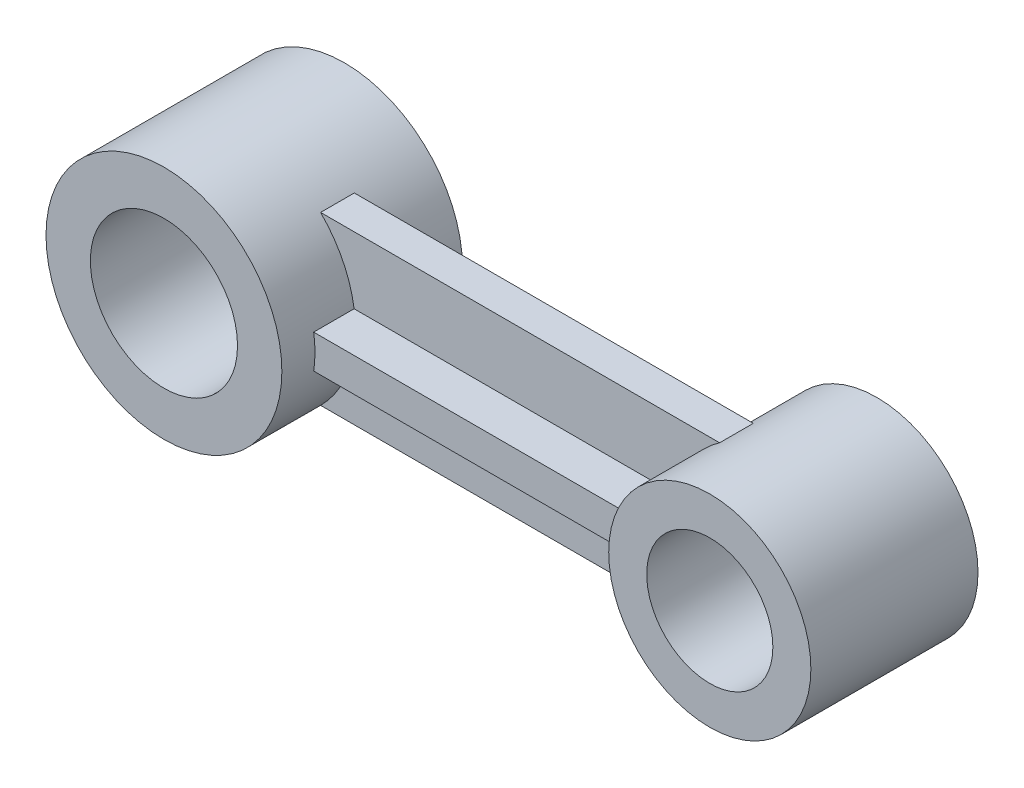
ISO-10303-21;
HEADER;
FILE_DESCRIPTION(('STEP AP214'),'2;1');
FILE_NAME('part.step','',(''),(''),'','','');
FILE_SCHEMA(('AUTOMOTIVE_DESIGN { 1 0 10303 214 1 1 1 1 }'));
ENDSEC;
DATA;
#1=APPLICATION_CONTEXT('core data for automotive mechanical design processes');
#2=APPLICATION_PROTOCOL_DEFINITION('international standard','automotive_design',2000,#1);
#3=PRODUCT_CONTEXT('',#1,'mechanical');
#4=PRODUCT('Part','Part','',(#3));
#5=PRODUCT_RELATED_PRODUCT_CATEGORY('part','',(#4));
#6=PRODUCT_DEFINITION_FORMATION('','',#4);
#7=PRODUCT_DEFINITION_CONTEXT('part definition',#1,'design');
#8=PRODUCT_DEFINITION('design','',#6,#7);
#9=PRODUCT_DEFINITION_SHAPE('','',#8);
#10=(LENGTH_UNIT() NAMED_UNIT(*) SI_UNIT(.MILLI.,.METRE.));
#11=(NAMED_UNIT(*) PLANE_ANGLE_UNIT() SI_UNIT($,.RADIAN.));
#12=(NAMED_UNIT(*) SI_UNIT($,.STERADIAN.) SOLID_ANGLE_UNIT());
#13=UNCERTAINTY_MEASURE_WITH_UNIT(LENGTH_MEASURE(1.E-05),#10,'distance_accuracy_value','');
#14=(GEOMETRIC_REPRESENTATION_CONTEXT(3) GLOBAL_UNCERTAINTY_ASSIGNED_CONTEXT((#13)) GLOBAL_UNIT_ASSIGNED_CONTEXT((#10,
#11,#12)) REPRESENTATION_CONTEXT('',''));
#15=CARTESIAN_POINT('',(0.,0.,0.));
#16=DIRECTION('',(0.,0.,1.));
#17=DIRECTION('',(1.,0.,0.));
#18=AXIS2_PLACEMENT_3D('',#15,#16,#17);
#19=CARTESIAN_POINT('',(-50.8,0.,17.018));
#20=DIRECTION('',(0.,0.,-1.));
#21=DIRECTION('',(-1.,0.,0.));
#22=AXIS2_PLACEMENT_3D('',#19,#20,#21);
#23=CYLINDRICAL_SURFACE('',#22,22.225);
#24=CARTESIAN_POINT('',(-50.8,0.,17.018));
#25=DIRECTION('',(0.,0.,1.));
#26=DIRECTION('',(1.,0.,0.));
#27=AXIS2_PLACEMENT_3D('',#24,#25,#26);
#28=CIRCLE('',#27,22.225);
#29=CARTESIAN_POINT('',(-28.575,0.,17.018));
#30=VERTEX_POINT('',#29);
#31=EDGE_CURVE('E156',#30,#30,#28,.T.);
#32=ORIENTED_EDGE('',*,*,#31,.F.);
#33=EDGE_LOOP('',(#32));
#34=FACE_BOUND('',#33,.T.);
#35=CARTESIAN_POINT('',(-50.8,0.,-17.018));
#36=DIRECTION('',(0.,0.,1.));
#37=DIRECTION('',(1.,0.,0.));
#38=AXIS2_PLACEMENT_3D('',#35,#36,#37);
#39=CIRCLE('',#38,22.225);
#40=CARTESIAN_POINT('',(-28.575,0.,-17.018));
#41=VERTEX_POINT('',#40);
#42=EDGE_CURVE('E269',#41,#41,#39,.T.);
#43=ORIENTED_EDGE('',*,*,#42,.T.);
#44=EDGE_LOOP('',(#43));
#45=FACE_BOUND('',#44,.T.);
#46=DIRECTION('',(0.,0.,-1.));
#47=VECTOR('',#46,1.);
#48=CARTESIAN_POINT('',(-28.8029547438753,3.175,17.018));
#49=LINE('',#48,#47);
#50=CARTESIAN_POINT('',(-28.8029547438753,3.175,3.175));
#51=VERTEX_POINT('',#50);
#52=CARTESIAN_POINT('',(-28.8029547438753,3.175,10.795));
#53=VERTEX_POINT('',#52);
#54=EDGE_CURVE('E194',#51,#53,#49,.F.);
#55=ORIENTED_EDGE('',*,*,#54,.F.);
#56=CARTESIAN_POINT('',(-50.8,0.,3.175));
#57=DIRECTION('',(0.,0.,1.));
#58=DIRECTION('',(1.,0.,0.));
#59=AXIS2_PLACEMENT_3D('',#56,#57,#58);
#60=CIRCLE('',#59,22.225);
#61=CARTESIAN_POINT('',(-35.1171711416594,15.748,3.175));
#62=VERTEX_POINT('',#61);
#63=EDGE_CURVE('E223',#51,#62,#60,.T.);
#64=ORIENTED_EDGE('',*,*,#63,.T.);
#65=DIRECTION('',(0.,0.,-1.));
#66=VECTOR('',#65,1.);
#67=CARTESIAN_POINT('',(-35.1171711416594,15.748,3.175));
#68=LINE('',#67,#66);
#69=CARTESIAN_POINT('',(-35.1171711416594,15.748,-3.175));
#70=VERTEX_POINT('',#69);
#71=EDGE_CURVE('E256',#62,#70,#68,.T.);
#72=ORIENTED_EDGE('',*,*,#71,.T.);
#73=CARTESIAN_POINT('',(-50.8,0.,-3.175));
#74=DIRECTION('',(0.,0.,1.));
#75=DIRECTION('',(1.,0.,0.));
#76=AXIS2_PLACEMENT_3D('',#73,#74,#75);
#77=CIRCLE('',#76,22.225);
#78=CARTESIAN_POINT('',(-28.8029547438753,3.175,-3.175));
#79=VERTEX_POINT('',#78);
#80=EDGE_CURVE('E241',#79,#70,#77,.T.);
#81=ORIENTED_EDGE('',*,*,#80,.F.);
#82=CARTESIAN_POINT('',(-28.8029547438753,3.175,-10.795));
#83=VERTEX_POINT('',#82);
#84=EDGE_CURVE('E63',#83,#79,#49,.F.);
#85=ORIENTED_EDGE('',*,*,#84,.F.);
#86=CARTESIAN_POINT('',(-50.8,0.,-10.795));
#87=DIRECTION('',(0.,0.,1.));
#88=DIRECTION('',(1.,0.,0.));
#89=AXIS2_PLACEMENT_3D('',#86,#87,#88);
#90=CIRCLE('',#89,22.225);
#91=CARTESIAN_POINT('',(-28.8029547438753,-3.175,-10.795));
#92=VERTEX_POINT('',#91);
#93=EDGE_CURVE('E67',#92,#83,#90,.T.);
#94=ORIENTED_EDGE('',*,*,#93,.F.);
#95=DIRECTION('',(0.,0.,-1.));
#96=VECTOR('',#95,1.);
#97=CARTESIAN_POINT('',(-28.8029547438753,-3.175,17.018));
#98=LINE('',#97,#96);
#99=CARTESIAN_POINT('',(-28.8029547438753,-3.175,-3.175));
#100=VERTEX_POINT('',#99);
#101=EDGE_CURVE('E159',#100,#92,#98,.T.);
#102=ORIENTED_EDGE('',*,*,#101,.F.);
#103=CARTESIAN_POINT('',(-35.1171711416594,-15.748,-3.175));
#104=VERTEX_POINT('',#103);
#105=EDGE_CURVE('E242',#104,#100,#77,.T.);
#106=ORIENTED_EDGE('',*,*,#105,.F.);
#107=DIRECTION('',(0.,0.,-1.));
#108=VECTOR('',#107,1.);
#109=CARTESIAN_POINT('',(-35.1171711416594,-15.748,3.175));
#110=LINE('',#109,#108);
#111=CARTESIAN_POINT('',(-35.1171711416594,-15.748,3.175));
#112=VERTEX_POINT('',#111);
#113=EDGE_CURVE('E252',#112,#104,#110,.T.);
#114=ORIENTED_EDGE('',*,*,#113,.F.);
#115=CARTESIAN_POINT('',(-28.8029547438753,-3.175,3.175));
#116=VERTEX_POINT('',#115);
#117=EDGE_CURVE('E224',#112,#116,#60,.T.);
#118=ORIENTED_EDGE('',*,*,#117,.T.);
#119=CARTESIAN_POINT('',(-28.8029547438753,-3.175,10.795));
#120=VERTEX_POINT('',#119);
#121=EDGE_CURVE('E181',#120,#116,#98,.T.);
#122=ORIENTED_EDGE('',*,*,#121,.F.);
#123=CARTESIAN_POINT('',(-50.8,0.,10.795));
#124=DIRECTION('',(0.,0.,1.));
#125=DIRECTION('',(1.,0.,0.));
#126=AXIS2_PLACEMENT_3D('',#123,#124,#125);
#127=CIRCLE('',#126,22.225);
#128=EDGE_CURVE('E173',#120,#53,#127,.T.);
#129=ORIENTED_EDGE('',*,*,#128,.T.);
#130=EDGE_LOOP('',(#55,#64,#72,#81,#85,#94,#102,#106,#114,#118,#122,#129));
#131=FACE_BOUND('',#130,.T.);
#132=ADVANCED_FACE('F45',(#34,#45,#131),#23,.T.);
#133=CARTESIAN_POINT('',(0.,0.,3.175));
#134=DIRECTION('',(0.,0.,1.));
#135=DIRECTION('',(1.,0.,0.));
#136=AXIS2_PLACEMENT_3D('',#133,#134,#135);
#137=PLANE('',#136);
#138=ORIENTED_EDGE('',*,*,#63,.F.);
#139=DIRECTION('',(1.,0.,0.));
#140=VECTOR('',#139,1.);
#141=CARTESIAN_POINT('',(0.,3.175,3.175));
#142=LINE('',#141,#140);
#143=CARTESIAN_POINT('',(32.0164466886587,3.175,3.175));
#144=VERTEX_POINT('',#143);
#145=EDGE_CURVE('E193',#51,#144,#142,.T.);
#146=ORIENTED_EDGE('',*,*,#145,.T.);
#147=CARTESIAN_POINT('',(50.8,0.,3.175));
#148=DIRECTION('',(0.,0.,1.));
#149=DIRECTION('',(1.,0.,0.));
#150=AXIS2_PLACEMENT_3D('',#147,#148,#149);
#151=CIRCLE('',#150,19.05);
#152=CARTESIAN_POINT('',(40.0807184942273,15.748,3.175));
#153=VERTEX_POINT('',#152);
#154=EDGE_CURVE('E214',#153,#144,#151,.T.);
#155=ORIENTED_EDGE('',*,*,#154,.F.);
#156=DIRECTION('',(1.,0.,0.));
#157=VECTOR('',#156,1.);
#158=CARTESIAN_POINT('',(0.,15.748,3.175));
#159=LINE('',#158,#157);
#160=EDGE_CURVE('E218',#62,#153,#159,.T.);
#161=ORIENTED_EDGE('',*,*,#160,.F.);
#162=EDGE_LOOP('',(#138,#146,#155,#161));
#163=FACE_BOUND('',#162,.T.);
#164=ADVANCED_FACE('F324',(#163),#137,.T.);
#165=CARTESIAN_POINT('',(32.0164466886587,-3.175,3.175));
#166=VERTEX_POINT('',#165);
#167=CARTESIAN_POINT('',(40.0807184942273,-15.748,3.175));
#168=VERTEX_POINT('',#167);
#169=EDGE_CURVE('E219',#166,#168,#151,.T.);
#170=ORIENTED_EDGE('',*,*,#169,.F.);
#171=DIRECTION('',(-1.,0.,0.));
#172=VECTOR('',#171,1.);
#173=CARTESIAN_POINT('',(0.,-3.175,3.175));
#174=LINE('',#173,#172);
#175=EDGE_CURVE('E177',#166,#116,#174,.T.);
#176=ORIENTED_EDGE('',*,*,#175,.T.);
#177=ORIENTED_EDGE('',*,*,#117,.F.);
#178=DIRECTION('',(1.,0.,0.));
#179=VECTOR('',#178,1.);
#180=CARTESIAN_POINT('',(0.,-15.748,3.175));
#181=LINE('',#180,#179);
#182=EDGE_CURVE('E228',#112,#168,#181,.T.);
#183=ORIENTED_EDGE('',*,*,#182,.T.);
#184=EDGE_LOOP('',(#170,#176,#177,#183));
#185=FACE_BOUND('',#184,.T.);
#186=ADVANCED_FACE('F291',(#185),#137,.T.);
#187=CARTESIAN_POINT('',(0.,0.,-3.175));
#188=DIRECTION('',(0.,0.,1.));
#189=DIRECTION('',(1.,0.,0.));
#190=AXIS2_PLACEMENT_3D('',#187,#188,#189);
#191=PLANE('',#190);
#192=DIRECTION('',(1.,0.,0.));
#193=VECTOR('',#192,1.);
#194=CARTESIAN_POINT('',(0.,3.175,-3.175));
#195=LINE('',#194,#193);
#196=CARTESIAN_POINT('',(32.0164466886587,3.175,-3.175));
#197=VERTEX_POINT('',#196);
#198=EDGE_CURVE('E187',#79,#197,#195,.T.);
#199=ORIENTED_EDGE('',*,*,#198,.F.);
#200=ORIENTED_EDGE('',*,*,#80,.T.);
#201=DIRECTION('',(1.,0.,0.));
#202=VECTOR('',#201,1.);
#203=CARTESIAN_POINT('',(0.,15.748,-3.175));
#204=LINE('',#203,#202);
#205=CARTESIAN_POINT('',(40.0807184942273,15.748,-3.175));
#206=VERTEX_POINT('',#205);
#207=EDGE_CURVE('E237',#70,#206,#204,.T.);
#208=ORIENTED_EDGE('',*,*,#207,.T.);
#209=CARTESIAN_POINT('',(50.8,0.,-3.175));
#210=DIRECTION('',(0.,0.,1.));
#211=DIRECTION('',(1.,0.,0.));
#212=AXIS2_PLACEMENT_3D('',#209,#210,#211);
#213=CIRCLE('',#212,19.05);
#214=EDGE_CURVE('E233',#206,#197,#213,.T.);
#215=ORIENTED_EDGE('',*,*,#214,.T.);
#216=EDGE_LOOP('',(#199,#200,#208,#215));
#217=FACE_BOUND('',#216,.T.);
#218=ADVANCED_FACE('F312',(#217),#191,.F.);
#219=DIRECTION('',(-1.,0.,0.));
#220=VECTOR('',#219,1.);
#221=CARTESIAN_POINT('',(0.,-3.175,-3.175));
#222=LINE('',#221,#220);
#223=CARTESIAN_POINT('',(32.0164466886587,-3.175,-3.175));
#224=VERTEX_POINT('',#223);
#225=EDGE_CURVE('E184',#224,#100,#222,.T.);
#226=ORIENTED_EDGE('',*,*,#225,.F.);
#227=CARTESIAN_POINT('',(40.0807184942273,-15.748,-3.175));
#228=VERTEX_POINT('',#227);
#229=EDGE_CURVE('E142',#224,#228,#213,.T.);
#230=ORIENTED_EDGE('',*,*,#229,.T.);
#231=DIRECTION('',(1.,0.,0.));
#232=VECTOR('',#231,1.);
#233=CARTESIAN_POINT('',(0.,-15.748,-3.175));
#234=LINE('',#233,#232);
#235=EDGE_CURVE('E246',#104,#228,#234,.T.);
#236=ORIENTED_EDGE('',*,*,#235,.F.);
#237=ORIENTED_EDGE('',*,*,#105,.T.);
#238=EDGE_LOOP('',(#226,#230,#236,#237));
#239=FACE_BOUND('',#238,.T.);
#240=ADVANCED_FACE('F310',(#239),#191,.F.);
#241=CARTESIAN_POINT('',(50.8,0.,15.748));
#242=DIRECTION('',(0.,0.,-1.));
#243=DIRECTION('',(-1.,0.,0.));
#244=AXIS2_PLACEMENT_3D('',#241,#242,#243);
#245=CYLINDRICAL_SURFACE('',#244,19.05);
#246=CARTESIAN_POINT('',(50.8,0.,15.748));
#247=DIRECTION('',(0.,0.,1.));
#248=DIRECTION('',(1.,0.,0.));
#249=AXIS2_PLACEMENT_3D('',#246,#247,#248);
#250=CIRCLE('',#249,19.05);
#251=CARTESIAN_POINT('',(69.85,0.,15.748));
#252=VERTEX_POINT('',#251);
#253=EDGE_CURVE('E202',#252,#252,#250,.T.);
#254=ORIENTED_EDGE('',*,*,#253,.F.);
#255=EDGE_LOOP('',(#254));
#256=FACE_BOUND('',#255,.T.);
#257=CARTESIAN_POINT('',(50.8,0.,-15.748));
#258=DIRECTION('',(0.,0.,1.));
#259=DIRECTION('',(1.,0.,0.));
#260=AXIS2_PLACEMENT_3D('',#257,#258,#259);
#261=CIRCLE('',#260,19.05);
#262=CARTESIAN_POINT('',(69.85,0.,-15.748));
#263=VERTEX_POINT('',#262);
#264=EDGE_CURVE('E203',#263,#263,#261,.T.);
#265=ORIENTED_EDGE('',*,*,#264,.T.);
#266=EDGE_LOOP('',(#265));
#267=FACE_BOUND('',#266,.T.);
#268=DIRECTION('',(0.,0.,-1.));
#269=VECTOR('',#268,1.);
#270=CARTESIAN_POINT('',(32.0164466886587,3.175,15.748));
#271=LINE('',#270,#269);
#272=CARTESIAN_POINT('',(32.0164466886587,3.175,10.795));
#273=VERTEX_POINT('',#272);
#274=EDGE_CURVE('E11',#273,#144,#271,.T.);
#275=ORIENTED_EDGE('',*,*,#274,.F.);
#276=CARTESIAN_POINT('',(50.8,0.,10.795));
#277=DIRECTION('',(0.,0.,1.));
#278=DIRECTION('',(1.,0.,0.));
#279=AXIS2_PLACEMENT_3D('',#276,#277,#278);
#280=CIRCLE('',#279,19.05);
#281=CARTESIAN_POINT('',(32.0164466886587,-3.175,10.795));
#282=VERTEX_POINT('',#281);
#283=EDGE_CURVE('E49',#273,#282,#280,.T.);
#284=ORIENTED_EDGE('',*,*,#283,.T.);
#285=DIRECTION('',(0.,0.,-1.));
#286=VECTOR('',#285,1.);
#287=CARTESIAN_POINT('',(32.0164466886587,-3.175,15.748));
#288=LINE('',#287,#286);
#289=EDGE_CURVE('E55',#166,#282,#288,.F.);
#290=ORIENTED_EDGE('',*,*,#289,.F.);
#291=ORIENTED_EDGE('',*,*,#169,.T.);
#292=DIRECTION('',(0.,0.,-1.));
#293=VECTOR('',#292,1.);
#294=CARTESIAN_POINT('',(40.0807184942273,-15.748,3.175));
#295=LINE('',#294,#293);
#296=EDGE_CURVE('E232',#168,#228,#295,.T.);
#297=ORIENTED_EDGE('',*,*,#296,.T.);
#298=ORIENTED_EDGE('',*,*,#229,.F.);
#299=CARTESIAN_POINT('',(32.0164466886587,-3.175,-10.795));
#300=VERTEX_POINT('',#299);
#301=EDGE_CURVE('E135',#300,#224,#288,.F.);
#302=ORIENTED_EDGE('',*,*,#301,.F.);
#303=CARTESIAN_POINT('',(50.8,0.,-10.795));
#304=DIRECTION('',(0.,0.,1.));
#305=DIRECTION('',(1.,0.,0.));
#306=AXIS2_PLACEMENT_3D('',#303,#304,#305);
#307=CIRCLE('',#306,19.05);
#308=CARTESIAN_POINT('',(32.0164466886587,3.175,-10.795));
#309=VERTEX_POINT('',#308);
#310=EDGE_CURVE('E139',#309,#300,#307,.T.);
#311=ORIENTED_EDGE('',*,*,#310,.F.);
#312=EDGE_CURVE('E56',#197,#309,#271,.T.);
#313=ORIENTED_EDGE('',*,*,#312,.F.);
#314=ORIENTED_EDGE('',*,*,#214,.F.);
#315=DIRECTION('',(0.,0.,-1.));
#316=VECTOR('',#315,1.);
#317=CARTESIAN_POINT('',(40.0807184942273,15.748,3.175));
#318=LINE('',#317,#316);
#319=EDGE_CURVE('E260',#153,#206,#318,.T.);
#320=ORIENTED_EDGE('',*,*,#319,.F.);
#321=ORIENTED_EDGE('',*,*,#154,.T.);
#322=EDGE_LOOP('',(#275,#284,#290,#291,#297,#298,#302,#311,#313,#314,#320,#321));
#323=FACE_BOUND('',#322,.T.);
#324=ADVANCED_FACE('F138',(#256,#267,#323),#245,.T.);
#325=CARTESIAN_POINT('',(-50.8,0.,17.018));
#326=DIRECTION('',(0.,0.,-1.));
#327=DIRECTION('',(-1.,0.,0.));
#328=AXIS2_PLACEMENT_3D('',#325,#326,#327);
#329=CYLINDRICAL_SURFACE('',#328,13.8684);
#330=CARTESIAN_POINT('',(-50.8,0.,17.018));
#331=DIRECTION('',(0.,0.,1.));
#332=DIRECTION('',(1.,0.,0.));
#333=AXIS2_PLACEMENT_3D('',#330,#331,#332);
#334=CIRCLE('',#333,13.8684);
#335=CARTESIAN_POINT('',(-36.9316,0.,17.018));
#336=VERTEX_POINT('',#335);
#337=EDGE_CURVE('E265',#336,#336,#334,.T.);
#338=ORIENTED_EDGE('',*,*,#337,.T.);
#339=EDGE_LOOP('',(#338));
#340=FACE_BOUND('',#339,.T.);
#341=CARTESIAN_POINT('',(-50.8,0.,-17.018));
#342=DIRECTION('',(0.,0.,1.));
#343=DIRECTION('',(1.,0.,0.));
#344=AXIS2_PLACEMENT_3D('',#341,#342,#343);
#345=CIRCLE('',#344,13.8684);
#346=CARTESIAN_POINT('',(-36.9316,0.,-17.018));
#347=VERTEX_POINT('',#346);
#348=EDGE_CURVE('E264',#347,#347,#345,.T.);
#349=ORIENTED_EDGE('',*,*,#348,.F.);
#350=EDGE_LOOP('',(#349));
#351=FACE_BOUND('',#350,.T.);
#352=ADVANCED_FACE('F47',(#340,#351),#329,.F.);
#353=CARTESIAN_POINT('',(0.,0.,17.018));
#354=DIRECTION('',(0.,0.,1.));
#355=DIRECTION('',(1.,0.,0.));
#356=AXIS2_PLACEMENT_3D('',#353,#354,#355);
#357=PLANE('',#356);
#358=ORIENTED_EDGE('',*,*,#337,.F.);
#359=EDGE_LOOP('',(#358));
#360=FACE_BOUND('',#359,.T.);
#361=ORIENTED_EDGE('',*,*,#31,.T.);
#362=EDGE_LOOP('',(#361));
#363=FACE_BOUND('',#362,.T.);
#364=ADVANCED_FACE('F337',(#360,#363),#357,.T.);
#365=CARTESIAN_POINT('',(0.,0.,-17.018));
#366=DIRECTION('',(0.,0.,1.));
#367=DIRECTION('',(1.,0.,0.));
#368=AXIS2_PLACEMENT_3D('',#365,#366,#367);
#369=PLANE('',#368);
#370=ORIENTED_EDGE('',*,*,#348,.T.);
#371=EDGE_LOOP('',(#370));
#372=FACE_BOUND('',#371,.T.);
#373=ORIENTED_EDGE('',*,*,#42,.F.);
#374=EDGE_LOOP('',(#373));
#375=FACE_BOUND('',#374,.T.);
#376=ADVANCED_FACE('F333',(#372,#375),#369,.F.);
#377=CARTESIAN_POINT('',(0.,15.748,3.175));
#378=DIRECTION('',(0.,1.,0.));
#379=DIRECTION('',(-1.,0.,0.));
#380=AXIS2_PLACEMENT_3D('',#377,#378,#379);
#381=PLANE('',#380);
#382=ORIENTED_EDGE('',*,*,#207,.F.);
#383=ORIENTED_EDGE('',*,*,#71,.F.);
#384=ORIENTED_EDGE('',*,*,#160,.T.);
#385=ORIENTED_EDGE('',*,*,#319,.T.);
#386=EDGE_LOOP('',(#382,#383,#384,#385));
#387=FACE_BOUND('',#386,.T.);
#388=ADVANCED_FACE('F336',(#387),#381,.T.);
#389=CARTESIAN_POINT('',(0.,-15.748,3.175));
#390=DIRECTION('',(0.,1.,0.));
#391=DIRECTION('',(-1.,0.,0.));
#392=AXIS2_PLACEMENT_3D('',#389,#390,#391);
#393=PLANE('',#392);
#394=ORIENTED_EDGE('',*,*,#235,.T.);
#395=ORIENTED_EDGE('',*,*,#296,.F.);
#396=ORIENTED_EDGE('',*,*,#182,.F.);
#397=ORIENTED_EDGE('',*,*,#113,.T.);
#398=EDGE_LOOP('',(#394,#395,#396,#397));
#399=FACE_BOUND('',#398,.T.);
#400=ADVANCED_FACE('F308',(#399),#393,.F.);
#401=CARTESIAN_POINT('',(50.8,0.,15.748));
#402=DIRECTION('',(0.,0.,-1.));
#403=DIRECTION('',(-1.,0.,0.));
#404=AXIS2_PLACEMENT_3D('',#401,#402,#403);
#405=CYLINDRICAL_SURFACE('',#404,11.8872);
#406=CARTESIAN_POINT('',(50.8,0.,15.748));
#407=DIRECTION('',(0.,0.,1.));
#408=DIRECTION('',(1.,0.,0.));
#409=AXIS2_PLACEMENT_3D('',#406,#407,#408);
#410=CIRCLE('',#409,11.8872);
#411=CARTESIAN_POINT('',(62.6872,0.,15.748));
#412=VERTEX_POINT('',#411);
#413=EDGE_CURVE('E198',#412,#412,#410,.T.);
#414=ORIENTED_EDGE('',*,*,#413,.T.);
#415=EDGE_LOOP('',(#414));
#416=FACE_BOUND('',#415,.T.);
#417=CARTESIAN_POINT('',(50.8,0.,-15.748));
#418=DIRECTION('',(0.,0.,1.));
#419=DIRECTION('',(1.,0.,0.));
#420=AXIS2_PLACEMENT_3D('',#417,#418,#419);
#421=CIRCLE('',#420,11.8872);
#422=CARTESIAN_POINT('',(62.6872,0.,-15.748));
#423=VERTEX_POINT('',#422);
#424=EDGE_CURVE('E207',#423,#423,#421,.T.);
#425=ORIENTED_EDGE('',*,*,#424,.F.);
#426=EDGE_LOOP('',(#425));
#427=FACE_BOUND('',#426,.T.);
#428=ADVANCED_FACE('F345',(#416,#427),#405,.F.);
#429=CARTESIAN_POINT('',(0.,0.,15.748));
#430=DIRECTION('',(0.,0.,1.));
#431=DIRECTION('',(1.,0.,0.));
#432=AXIS2_PLACEMENT_3D('',#429,#430,#431);
#433=PLANE('',#432);
#434=ORIENTED_EDGE('',*,*,#413,.F.);
#435=EDGE_LOOP('',(#434));
#436=FACE_BOUND('',#435,.T.);
#437=ORIENTED_EDGE('',*,*,#253,.T.);
#438=EDGE_LOOP('',(#437));
#439=FACE_BOUND('',#438,.T.);
#440=ADVANCED_FACE('F349',(#436,#439),#433,.T.);
#441=CARTESIAN_POINT('',(0.,0.,-15.748));
#442=DIRECTION('',(0.,0.,1.));
#443=DIRECTION('',(1.,0.,0.));
#444=AXIS2_PLACEMENT_3D('',#441,#442,#443);
#445=PLANE('',#444);
#446=ORIENTED_EDGE('',*,*,#424,.T.);
#447=EDGE_LOOP('',(#446));
#448=FACE_BOUND('',#447,.T.);
#449=ORIENTED_EDGE('',*,*,#264,.F.);
#450=EDGE_LOOP('',(#449));
#451=FACE_BOUND('',#450,.T.);
#452=ADVANCED_FACE('F355',(#448,#451),#445,.F.);
#453=CARTESIAN_POINT('',(0.,0.,-10.795));
#454=DIRECTION('',(0.,0.,1.));
#455=DIRECTION('',(1.,0.,0.));
#456=AXIS2_PLACEMENT_3D('',#453,#454,#455);
#457=PLANE('',#456);
#458=DIRECTION('',(1.,0.,0.));
#459=VECTOR('',#458,1.);
#460=CARTESIAN_POINT('',(-34.3299122404601,-3.175,-10.795));
#461=LINE('',#460,#459);
#462=EDGE_CURVE('E152',#92,#300,#461,.T.);
#463=ORIENTED_EDGE('',*,*,#462,.F.);
#464=ORIENTED_EDGE('',*,*,#93,.T.);
#465=DIRECTION('',(-1.,0.,0.));
#466=VECTOR('',#465,1.);
#467=CARTESIAN_POINT('',(-34.3299122404601,3.175,-10.795));
#468=LINE('',#467,#466);
#469=EDGE_CURVE('E154',#309,#83,#468,.T.);
#470=ORIENTED_EDGE('',*,*,#469,.F.);
#471=ORIENTED_EDGE('',*,*,#310,.T.);
#472=EDGE_LOOP('',(#463,#464,#470,#471));
#473=FACE_BOUND('',#472,.T.);
#474=ADVANCED_FACE('F151',(#473),#457,.F.);
#475=CARTESIAN_POINT('',(-34.3299122404601,-3.175,10.795));
#476=DIRECTION('',(0.,1.,0.));
#477=DIRECTION('',(0.,0.,1.));
#478=AXIS2_PLACEMENT_3D('',#475,#476,#477);
#479=PLANE('',#478);
#480=ORIENTED_EDGE('',*,*,#225,.T.);
#481=ORIENTED_EDGE('',*,*,#101,.T.);
#482=ORIENTED_EDGE('',*,*,#462,.T.);
#483=ORIENTED_EDGE('',*,*,#301,.T.);
#484=EDGE_LOOP('',(#480,#481,#482,#483));
#485=FACE_BOUND('',#484,.T.);
#486=ADVANCED_FACE('F158',(#485),#479,.F.);
#487=CARTESIAN_POINT('',(-34.3299122404601,3.175,10.795));
#488=DIRECTION('',(0.,-1.,0.));
#489=DIRECTION('',(0.,0.,-1.));
#490=AXIS2_PLACEMENT_3D('',#487,#488,#489);
#491=PLANE('',#490);
#492=ORIENTED_EDGE('',*,*,#469,.T.);
#493=ORIENTED_EDGE('',*,*,#84,.T.);
#494=ORIENTED_EDGE('',*,*,#198,.T.);
#495=ORIENTED_EDGE('',*,*,#312,.T.);
#496=EDGE_LOOP('',(#492,#493,#494,#495));
#497=FACE_BOUND('',#496,.T.);
#498=ADVANCED_FACE('F366',(#497),#491,.F.);
#499=ORIENTED_EDGE('',*,*,#145,.F.);
#500=ORIENTED_EDGE('',*,*,#54,.T.);
#501=DIRECTION('',(-1.,0.,0.));
#502=VECTOR('',#501,1.);
#503=CARTESIAN_POINT('',(-34.3299122404601,3.175,10.795));
#504=LINE('',#503,#502);
#505=EDGE_CURVE('E161',#273,#53,#504,.T.);
#506=ORIENTED_EDGE('',*,*,#505,.F.);
#507=ORIENTED_EDGE('',*,*,#274,.T.);
#508=EDGE_LOOP('',(#499,#500,#506,#507));
#509=FACE_BOUND('',#508,.T.);
#510=ADVANCED_FACE('F363',(#509),#491,.F.);
#511=DIRECTION('',(1.,0.,0.));
#512=VECTOR('',#511,1.);
#513=CARTESIAN_POINT('',(-34.3299122404601,-3.175,10.795));
#514=LINE('',#513,#512);
#515=EDGE_CURVE('E166',#120,#282,#514,.T.);
#516=ORIENTED_EDGE('',*,*,#515,.F.);
#517=ORIENTED_EDGE('',*,*,#121,.T.);
#518=ORIENTED_EDGE('',*,*,#175,.F.);
#519=ORIENTED_EDGE('',*,*,#289,.T.);
#520=EDGE_LOOP('',(#516,#517,#518,#519));
#521=FACE_BOUND('',#520,.T.);
#522=ADVANCED_FACE('F287',(#521),#479,.F.);
#523=CARTESIAN_POINT('',(0.,0.,10.795));
#524=DIRECTION('',(0.,0.,1.));
#525=DIRECTION('',(1.,0.,0.));
#526=AXIS2_PLACEMENT_3D('',#523,#524,#525);
#527=PLANE('',#526);
#528=ORIENTED_EDGE('',*,*,#128,.F.);
#529=ORIENTED_EDGE('',*,*,#515,.T.);
#530=ORIENTED_EDGE('',*,*,#283,.F.);
#531=ORIENTED_EDGE('',*,*,#505,.T.);
#532=EDGE_LOOP('',(#528,#529,#530,#531));
#533=FACE_BOUND('',#532,.T.);
#534=ADVANCED_FACE('F302',(#533),#527,.T.);
#535=CLOSED_SHELL('',(#132,#164,#186,#218,#240,#324,#352,#364,#376,#388,#400,#428,#440,#452,
#474,#486,#498,#510,#522,#534));
#536=MANIFOLD_SOLID_BREP('B2',#535);
#537=ADVANCED_BREP_SHAPE_REPRESENTATION('',(#18,#536),#14);
#538=SHAPE_DEFINITION_REPRESENTATION(#9,#537);
ENDSEC;
END-ISO-10303-21;
